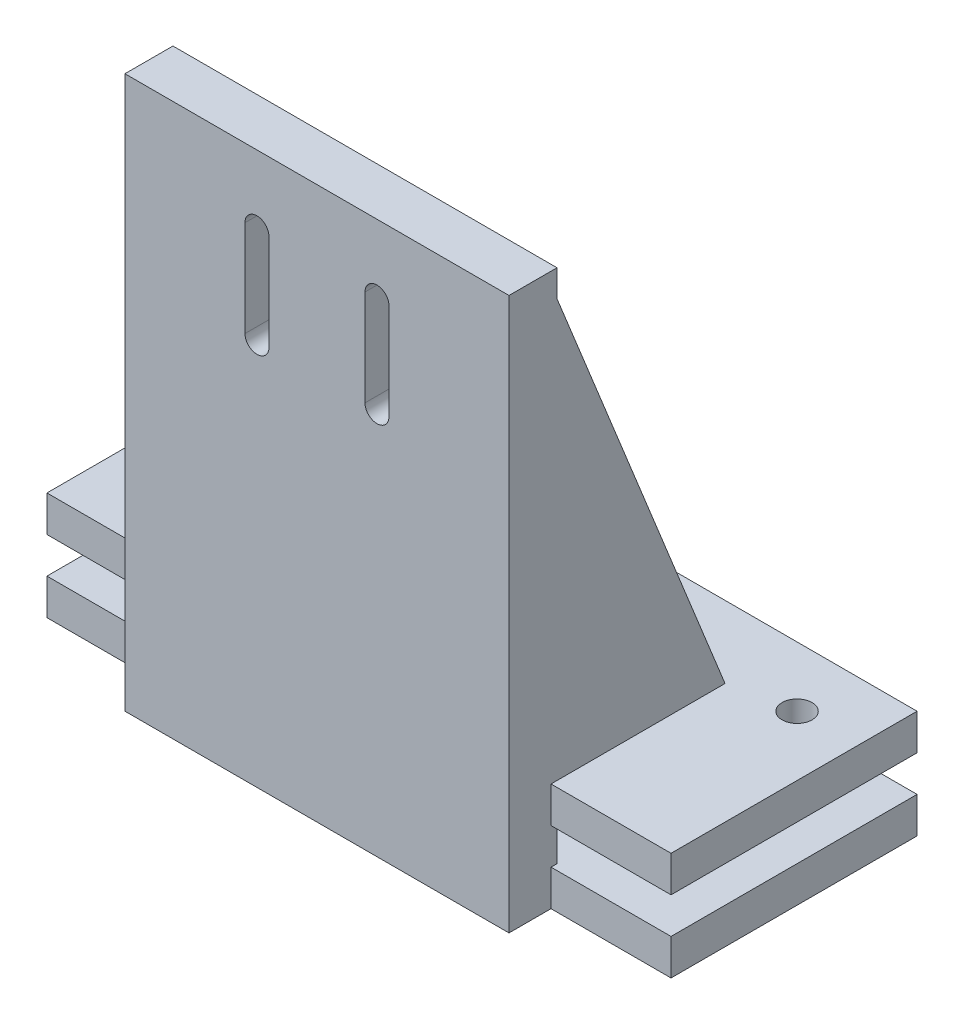
ISO-10303-21;
HEADER;
FILE_DESCRIPTION(('STEP AP214'),'2;1');
FILE_NAME('part.step','',(''),(''),'','','');
FILE_SCHEMA(('AUTOMOTIVE_DESIGN { 1 0 10303 214 1 1 1 1 }'));
ENDSEC;
DATA;
#1=APPLICATION_CONTEXT('core data for automotive mechanical design processes');
#2=APPLICATION_PROTOCOL_DEFINITION('international standard','automotive_design',2000,#1);
#3=PRODUCT_CONTEXT('',#1,'mechanical');
#4=PRODUCT('Part','Part','',(#3));
#5=PRODUCT_RELATED_PRODUCT_CATEGORY('part','',(#4));
#6=PRODUCT_DEFINITION_FORMATION('','',#4);
#7=PRODUCT_DEFINITION_CONTEXT('part definition',#1,'design');
#8=PRODUCT_DEFINITION('design','',#6,#7);
#9=PRODUCT_DEFINITION_SHAPE('','',#8);
#10=(LENGTH_UNIT() NAMED_UNIT(*) SI_UNIT(.MILLI.,.METRE.));
#11=(NAMED_UNIT(*) PLANE_ANGLE_UNIT() SI_UNIT($,.RADIAN.));
#12=(NAMED_UNIT(*) SI_UNIT($,.STERADIAN.) SOLID_ANGLE_UNIT());
#13=UNCERTAINTY_MEASURE_WITH_UNIT(LENGTH_MEASURE(1.E-05),#10,'distance_accuracy_value','');
#14=(GEOMETRIC_REPRESENTATION_CONTEXT(3) GLOBAL_UNCERTAINTY_ASSIGNED_CONTEXT((#13)) GLOBAL_UNIT_ASSIGNED_CONTEXT((#10,
#11,#12)) REPRESENTATION_CONTEXT('',''));
#15=CARTESIAN_POINT('',(0.,0.,0.));
#16=DIRECTION('',(0.,0.,1.));
#17=DIRECTION('',(1.,0.,0.));
#18=AXIS2_PLACEMENT_3D('',#15,#16,#17);
#19=CARTESIAN_POINT('',(0.,0.,0.));
#20=DIRECTION('',(0.,0.,-1.));
#21=DIRECTION('',(-1.,0.,0.));
#22=AXIS2_PLACEMENT_3D('',#19,#20,#21);
#23=PLANE('',#22);
#24=DIRECTION('',(0.,1.,0.));
#25=VECTOR('',#24,1.);
#26=CARTESIAN_POINT('',(32.,-11.5,0.));
#27=LINE('',#26,#25);
#28=CARTESIAN_POINT('',(32.,76.0172413793104,0.));
#29=VERTEX_POINT('',#28);
#30=CARTESIAN_POINT('',(32.,80.5,0.));
#31=VERTEX_POINT('',#30);
#32=EDGE_CURVE('E419',#29,#31,#27,.T.);
#33=ORIENTED_EDGE('',*,*,#32,.F.);
#34=DIRECTION('',(-1.,0.,0.));
#35=VECTOR('',#34,1.);
#36=CARTESIAN_POINT('',(0.,76.0172413793103,0.));
#37=LINE('',#36,#35);
#38=CARTESIAN_POINT('',(26.,76.0172413793103,0.));
#39=VERTEX_POINT('',#38);
#40=EDGE_CURVE('E314',#29,#39,#37,.T.);
#41=ORIENTED_EDGE('',*,*,#40,.T.);
#42=DIRECTION('',(0.,1.,0.));
#43=VECTOR('',#42,1.);
#44=CARTESIAN_POINT('',(26.,0.,0.));
#45=LINE('',#44,#43);
#46=CARTESIAN_POINT('',(26.,6.5,0.));
#47=VERTEX_POINT('',#46);
#48=EDGE_CURVE('E317',#47,#39,#45,.T.);
#49=ORIENTED_EDGE('',*,*,#48,.F.);
#50=DIRECTION('',(-1.,0.,0.));
#51=VECTOR('',#50,1.);
#52=CARTESIAN_POINT('',(0.,6.5,0.));
#53=LINE('',#52,#51);
#54=CARTESIAN_POINT('',(-26.,6.5,0.));
#55=VERTEX_POINT('',#54);
#56=EDGE_CURVE('E456',#47,#55,#53,.T.);
#57=ORIENTED_EDGE('',*,*,#56,.T.);
#58=DIRECTION('',(0.,1.,0.));
#59=VECTOR('',#58,1.);
#60=CARTESIAN_POINT('',(-26.,0.,0.));
#61=LINE('',#60,#59);
#62=CARTESIAN_POINT('',(-26.,76.0172413793103,0.));
#63=VERTEX_POINT('',#62);
#64=EDGE_CURVE('E327',#55,#63,#61,.T.);
#65=ORIENTED_EDGE('',*,*,#64,.T.);
#66=DIRECTION('',(-1.,0.,0.));
#67=VECTOR('',#66,1.);
#68=CARTESIAN_POINT('',(0.,76.0172413793103,0.));
#69=LINE('',#68,#67);
#70=CARTESIAN_POINT('',(-32.,76.0172413793103,0.));
#71=VERTEX_POINT('',#70);
#72=EDGE_CURVE('E330',#63,#71,#69,.T.);
#73=ORIENTED_EDGE('',*,*,#72,.T.);
#74=DIRECTION('',(0.,-1.,0.));
#75=VECTOR('',#74,1.);
#76=CARTESIAN_POINT('',(-32.,-11.5,0.));
#77=LINE('',#76,#75);
#78=CARTESIAN_POINT('',(-32.,80.5,0.));
#79=VERTEX_POINT('',#78);
#80=EDGE_CURVE('E424',#79,#71,#77,.T.);
#81=ORIENTED_EDGE('',*,*,#80,.F.);
#82=DIRECTION('',(-1.,0.,0.));
#83=VECTOR('',#82,1.);
#84=CARTESIAN_POINT('',(-32.,80.5,0.));
#85=LINE('',#84,#83);
#86=EDGE_CURVE('E434',#31,#79,#85,.T.);
#87=ORIENTED_EDGE('',*,*,#86,.F.);
#88=EDGE_LOOP('',(#33,#41,#49,#57,#65,#73,#81,#87));
#89=FACE_BOUND('',#88,.T.);
#90=DIRECTION('',(0.,-1.,0.));
#91=VECTOR('',#90,1.);
#92=CARTESIAN_POINT('',(8.,69.,0.));
#93=LINE('',#92,#91);
#94=CARTESIAN_POINT('',(8.,69.,0.));
#95=VERTEX_POINT('',#94);
#96=CARTESIAN_POINT('',(8.,53.,0.));
#97=VERTEX_POINT('',#96);
#98=EDGE_CURVE('E279',#95,#97,#93,.T.);
#99=ORIENTED_EDGE('',*,*,#98,.T.);
#100=CARTESIAN_POINT('',(10.,53.,0.));
#101=DIRECTION('',(0.,0.,1.));
#102=DIRECTION('',(1.,0.,0.));
#103=AXIS2_PLACEMENT_3D('',#100,#101,#102);
#104=CIRCLE('',#103,2.);
#105=CARTESIAN_POINT('',(12.,53.,0.));
#106=VERTEX_POINT('',#105);
#107=EDGE_CURVE('E60',#97,#106,#104,.T.);
#108=ORIENTED_EDGE('',*,*,#107,.T.);
#109=DIRECTION('',(0.,1.,0.));
#110=VECTOR('',#109,1.);
#111=CARTESIAN_POINT('',(12.,53.,0.));
#112=LINE('',#111,#110);
#113=CARTESIAN_POINT('',(12.,69.,0.));
#114=VERTEX_POINT('',#113);
#115=EDGE_CURVE('E288',#106,#114,#112,.T.);
#116=ORIENTED_EDGE('',*,*,#115,.T.);
#117=CARTESIAN_POINT('',(10.,69.,0.));
#118=DIRECTION('',(0.,0.,1.));
#119=DIRECTION('',(1.,0.,0.));
#120=AXIS2_PLACEMENT_3D('',#117,#118,#119);
#121=CIRCLE('',#120,2.);
#122=EDGE_CURVE('E292',#114,#95,#121,.T.);
#123=ORIENTED_EDGE('',*,*,#122,.T.);
#124=EDGE_LOOP('',(#99,#108,#116,#123));
#125=FACE_BOUND('',#124,.T.);
#126=DIRECTION('',(0.,-1.,0.));
#127=VECTOR('',#126,1.);
#128=CARTESIAN_POINT('',(-12.,69.,0.));
#129=LINE('',#128,#127);
#130=CARTESIAN_POINT('',(-12.,69.,0.));
#131=VERTEX_POINT('',#130);
#132=CARTESIAN_POINT('',(-12.,53.,0.));
#133=VERTEX_POINT('',#132);
#134=EDGE_CURVE('E244',#131,#133,#129,.T.);
#135=ORIENTED_EDGE('',*,*,#134,.T.);
#136=CARTESIAN_POINT('',(-10.,53.,0.));
#137=DIRECTION('',(0.,0.,1.));
#138=DIRECTION('',(1.,0.,0.));
#139=AXIS2_PLACEMENT_3D('',#136,#137,#138);
#140=CIRCLE('',#139,2.);
#141=CARTESIAN_POINT('',(-8.,53.,0.));
#142=VERTEX_POINT('',#141);
#143=EDGE_CURVE('E52',#133,#142,#140,.T.);
#144=ORIENTED_EDGE('',*,*,#143,.T.);
#145=DIRECTION('',(0.,1.,0.));
#146=VECTOR('',#145,1.);
#147=CARTESIAN_POINT('',(-8.,53.,0.));
#148=LINE('',#147,#146);
#149=CARTESIAN_POINT('',(-8.,69.,0.));
#150=VERTEX_POINT('',#149);
#151=EDGE_CURVE('E250',#142,#150,#148,.T.);
#152=ORIENTED_EDGE('',*,*,#151,.T.);
#153=CARTESIAN_POINT('',(-10.,69.,0.));
#154=DIRECTION('',(0.,0.,1.));
#155=DIRECTION('',(1.,0.,0.));
#156=AXIS2_PLACEMENT_3D('',#153,#154,#155);
#157=CIRCLE('',#156,2.);
#158=EDGE_CURVE('E267',#150,#131,#157,.T.);
#159=ORIENTED_EDGE('',*,*,#158,.T.);
#160=EDGE_LOOP('',(#135,#144,#152,#159));
#161=FACE_BOUND('',#160,.T.);
#162=ADVANCED_FACE('F35',(#89,#125,#161),#23,.T.);
#163=CARTESIAN_POINT('',(0.,0.,8.));
#164=DIRECTION('',(0.,0.,-1.));
#165=DIRECTION('',(-1.,0.,0.));
#166=AXIS2_PLACEMENT_3D('',#163,#164,#165);
#167=PLANE('',#166);
#168=CARTESIAN_POINT('',(10.,53.,8.));
#169=DIRECTION('',(0.,0.,1.));
#170=DIRECTION('',(1.,0.,0.));
#171=AXIS2_PLACEMENT_3D('',#168,#169,#170);
#172=CIRCLE('',#171,2.);
#173=CARTESIAN_POINT('',(8.,53.,8.));
#174=VERTEX_POINT('',#173);
#175=CARTESIAN_POINT('',(12.,53.,8.));
#176=VERTEX_POINT('',#175);
#177=EDGE_CURVE('E276',#174,#176,#172,.T.);
#178=ORIENTED_EDGE('',*,*,#177,.F.);
#179=DIRECTION('',(0.,-1.,0.));
#180=VECTOR('',#179,1.);
#181=CARTESIAN_POINT('',(8.,69.,8.));
#182=LINE('',#181,#180);
#183=CARTESIAN_POINT('',(8.,69.,8.));
#184=VERTEX_POINT('',#183);
#185=EDGE_CURVE('E284',#184,#174,#182,.T.);
#186=ORIENTED_EDGE('',*,*,#185,.F.);
#187=CARTESIAN_POINT('',(10.,69.,8.));
#188=DIRECTION('',(0.,0.,1.));
#189=DIRECTION('',(1.,0.,0.));
#190=AXIS2_PLACEMENT_3D('',#187,#188,#189);
#191=CIRCLE('',#190,2.);
#192=CARTESIAN_POINT('',(12.,69.,8.));
#193=VERTEX_POINT('',#192);
#194=EDGE_CURVE('E281',#193,#184,#191,.T.);
#195=ORIENTED_EDGE('',*,*,#194,.F.);
#196=DIRECTION('',(0.,1.,0.));
#197=VECTOR('',#196,1.);
#198=CARTESIAN_POINT('',(12.,53.,8.));
#199=LINE('',#198,#197);
#200=EDGE_CURVE('E278',#176,#193,#199,.T.);
#201=ORIENTED_EDGE('',*,*,#200,.F.);
#202=EDGE_LOOP('',(#178,#186,#195,#201));
#203=FACE_BOUND('',#202,.T.);
#204=DIRECTION('',(0.,1.,0.));
#205=VECTOR('',#204,1.);
#206=CARTESIAN_POINT('',(32.,-11.5,8.));
#207=LINE('',#206,#205);
#208=CARTESIAN_POINT('',(32.,-11.5,8.));
#209=VERTEX_POINT('',#208);
#210=CARTESIAN_POINT('',(32.,80.5,8.));
#211=VERTEX_POINT('',#210);
#212=EDGE_CURVE('E420',#209,#211,#207,.T.);
#213=ORIENTED_EDGE('',*,*,#212,.T.);
#214=DIRECTION('',(-1.,0.,0.));
#215=VECTOR('',#214,1.);
#216=CARTESIAN_POINT('',(-32.,80.5,8.));
#217=LINE('',#216,#215);
#218=CARTESIAN_POINT('',(-32.,80.5,8.));
#219=VERTEX_POINT('',#218);
#220=EDGE_CURVE('E423',#211,#219,#217,.T.);
#221=ORIENTED_EDGE('',*,*,#220,.T.);
#222=DIRECTION('',(0.,-1.,0.));
#223=VECTOR('',#222,1.);
#224=CARTESIAN_POINT('',(-32.,-11.5,8.));
#225=LINE('',#224,#223);
#226=CARTESIAN_POINT('',(-32.,-11.5,8.));
#227=VERTEX_POINT('',#226);
#228=EDGE_CURVE('E426',#219,#227,#225,.T.);
#229=ORIENTED_EDGE('',*,*,#228,.T.);
#230=DIRECTION('',(1.,0.,0.));
#231=VECTOR('',#230,1.);
#232=CARTESIAN_POINT('',(-32.,-11.5,8.));
#233=LINE('',#232,#231);
#234=EDGE_CURVE('E428',#227,#209,#233,.T.);
#235=ORIENTED_EDGE('',*,*,#234,.T.);
#236=EDGE_LOOP('',(#213,#221,#229,#235));
#237=FACE_BOUND('',#236,.T.);
#238=CARTESIAN_POINT('',(-10.,53.,8.));
#239=DIRECTION('',(0.,0.,1.));
#240=DIRECTION('',(1.,0.,0.));
#241=AXIS2_PLACEMENT_3D('',#238,#239,#240);
#242=CIRCLE('',#241,2.);
#243=CARTESIAN_POINT('',(-12.,53.,8.));
#244=VERTEX_POINT('',#243);
#245=CARTESIAN_POINT('',(-8.,53.,8.));
#246=VERTEX_POINT('',#245);
#247=EDGE_CURVE('E235',#244,#246,#242,.T.);
#248=ORIENTED_EDGE('',*,*,#247,.F.);
#249=DIRECTION('',(0.,-1.,0.));
#250=VECTOR('',#249,1.);
#251=CARTESIAN_POINT('',(-12.,69.,8.));
#252=LINE('',#251,#250);
#253=CARTESIAN_POINT('',(-12.,69.,8.));
#254=VERTEX_POINT('',#253);
#255=EDGE_CURVE('E259',#254,#244,#252,.T.);
#256=ORIENTED_EDGE('',*,*,#255,.F.);
#257=CARTESIAN_POINT('',(-10.,69.,8.));
#258=DIRECTION('',(0.,0.,1.));
#259=DIRECTION('',(1.,0.,0.));
#260=AXIS2_PLACEMENT_3D('',#257,#258,#259);
#261=CIRCLE('',#260,2.);
#262=CARTESIAN_POINT('',(-8.,69.,8.));
#263=VERTEX_POINT('',#262);
#264=EDGE_CURVE('E257',#263,#254,#261,.T.);
#265=ORIENTED_EDGE('',*,*,#264,.F.);
#266=DIRECTION('',(0.,1.,0.));
#267=VECTOR('',#266,1.);
#268=CARTESIAN_POINT('',(-8.,53.,8.));
#269=LINE('',#268,#267);
#270=EDGE_CURVE('E243',#246,#263,#269,.T.);
#271=ORIENTED_EDGE('',*,*,#270,.F.);
#272=EDGE_LOOP('',(#248,#256,#265,#271));
#273=FACE_BOUND('',#272,.T.);
#274=ADVANCED_FACE('F255',(#203,#237,#273),#167,.F.);
#275=CARTESIAN_POINT('',(-52.,6.5,1.));
#276=DIRECTION('',(0.,-1.,0.));
#277=DIRECTION('',(0.,0.,-1.));
#278=AXIS2_PLACEMENT_3D('',#275,#276,#277);
#279=PLANE('',#278);
#280=CARTESIAN_POINT('',(-42.,6.5,-30.));
#281=DIRECTION('',(0.,1.,0.));
#282=DIRECTION('',(0.,0.,1.));
#283=AXIS2_PLACEMENT_3D('',#280,#281,#282);
#284=CIRCLE('',#283,2.5);
#285=CARTESIAN_POINT('',(-42.,6.5,-27.5));
#286=VERTEX_POINT('',#285);
#287=EDGE_CURVE('E461',#286,#286,#284,.T.);
#288=ORIENTED_EDGE('',*,*,#287,.F.);
#289=EDGE_LOOP('',(#288));
#290=FACE_BOUND('',#289,.T.);
#291=CARTESIAN_POINT('',(42.,6.5,-30.));
#292=DIRECTION('',(0.,1.,0.));
#293=DIRECTION('',(0.,0.,1.));
#294=AXIS2_PLACEMENT_3D('',#291,#292,#293);
#295=CIRCLE('',#294,2.5);
#296=CARTESIAN_POINT('',(42.,6.5,-27.5));
#297=VERTEX_POINT('',#296);
#298=EDGE_CURVE('E472',#297,#297,#295,.T.);
#299=ORIENTED_EDGE('',*,*,#298,.F.);
#300=EDGE_LOOP('',(#299));
#301=FACE_BOUND('',#300,.T.);
#302=DIRECTION('',(-1.,0.,0.));
#303=VECTOR('',#302,1.);
#304=CARTESIAN_POINT('',(32.,6.5,-28.));
#305=LINE('',#304,#303);
#306=CARTESIAN_POINT('',(32.,6.5,-28.));
#307=VERTEX_POINT('',#306);
#308=CARTESIAN_POINT('',(26.,6.5,-28.));
#309=VERTEX_POINT('',#308);
#310=EDGE_CURVE('E306',#307,#309,#305,.T.);
#311=ORIENTED_EDGE('',*,*,#310,.F.);
#312=DIRECTION('',(0.,0.,1.));
#313=VECTOR('',#312,1.);
#314=CARTESIAN_POINT('',(32.,6.5,8.));
#315=LINE('',#314,#313);
#316=CARTESIAN_POINT('',(32.,6.5,1.));
#317=VERTEX_POINT('',#316);
#318=EDGE_CURVE('E373',#307,#317,#315,.T.);
#319=ORIENTED_EDGE('',*,*,#318,.T.);
#320=DIRECTION('',(-1.,0.,0.));
#321=VECTOR('',#320,1.);
#322=CARTESIAN_POINT('',(-52.,6.5,1.));
#323=LINE('',#322,#321);
#324=CARTESIAN_POINT('',(52.,6.5,1.));
#325=VERTEX_POINT('',#324);
#326=EDGE_CURVE('E339',#325,#317,#323,.T.);
#327=ORIENTED_EDGE('',*,*,#326,.F.);
#328=DIRECTION('',(0.,0.,-1.));
#329=VECTOR('',#328,1.);
#330=CARTESIAN_POINT('',(52.,6.5,1.));
#331=LINE('',#330,#329);
#332=CARTESIAN_POINT('',(52.,6.5,-40.));
#333=VERTEX_POINT('',#332);
#334=EDGE_CURVE('E364',#325,#333,#331,.T.);
#335=ORIENTED_EDGE('',*,*,#334,.T.);
#336=DIRECTION('',(-1.,0.,0.));
#337=VECTOR('',#336,1.);
#338=CARTESIAN_POINT('',(-52.,6.5,-40.));
#339=LINE('',#338,#337);
#340=CARTESIAN_POINT('',(-52.,6.5,-40.));
#341=VERTEX_POINT('',#340);
#342=EDGE_CURVE('E351',#333,#341,#339,.T.);
#343=ORIENTED_EDGE('',*,*,#342,.T.);
#344=DIRECTION('',(0.,0.,-1.));
#345=VECTOR('',#344,1.);
#346=CARTESIAN_POINT('',(-52.,6.5,1.));
#347=LINE('',#346,#345);
#348=CARTESIAN_POINT('',(-52.,6.5,1.));
#349=VERTEX_POINT('',#348);
#350=EDGE_CURVE('E361',#349,#341,#347,.T.);
#351=ORIENTED_EDGE('',*,*,#350,.F.);
#352=CARTESIAN_POINT('',(-32.,6.5,1.));
#353=VERTEX_POINT('',#352);
#354=EDGE_CURVE('E337',#353,#349,#323,.T.);
#355=ORIENTED_EDGE('',*,*,#354,.F.);
#356=DIRECTION('',(0.,0.,-1.));
#357=VECTOR('',#356,1.);
#358=CARTESIAN_POINT('',(-32.,6.5,8.));
#359=LINE('',#358,#357);
#360=CARTESIAN_POINT('',(-32.,6.5,-28.));
#361=VERTEX_POINT('',#360);
#362=EDGE_CURVE('E371',#353,#361,#359,.T.);
#363=ORIENTED_EDGE('',*,*,#362,.T.);
#364=DIRECTION('',(-1.,0.,0.));
#365=VECTOR('',#364,1.);
#366=CARTESIAN_POINT('',(-26.,6.5,-28.));
#367=LINE('',#366,#365);
#368=CARTESIAN_POINT('',(-26.,6.5,-28.));
#369=VERTEX_POINT('',#368);
#370=EDGE_CURVE('E323',#369,#361,#367,.T.);
#371=ORIENTED_EDGE('',*,*,#370,.F.);
#372=DIRECTION('',(0.,0.,-1.));
#373=VECTOR('',#372,1.);
#374=CARTESIAN_POINT('',(-26.,6.5,1.));
#375=LINE('',#374,#373);
#376=EDGE_CURVE('E11',#55,#369,#375,.T.);
#377=ORIENTED_EDGE('',*,*,#376,.F.);
#378=ORIENTED_EDGE('',*,*,#56,.F.);
#379=DIRECTION('',(0.,0.,-1.));
#380=VECTOR('',#379,1.);
#381=CARTESIAN_POINT('',(26.,6.5,-28.));
#382=LINE('',#381,#380);
#383=EDGE_CURVE('E307',#47,#309,#382,.T.);
#384=ORIENTED_EDGE('',*,*,#383,.T.);
#385=EDGE_LOOP('',(#311,#319,#327,#335,#343,#351,#355,#363,#371,#377,#378,#384));
#386=FACE_BOUND('',#385,.T.);
#387=ADVANCED_FACE('F520',(#290,#301,#386),#279,.F.);
#388=CARTESIAN_POINT('',(32.,-11.5,8.));
#389=DIRECTION('',(-1.,0.,0.));
#390=DIRECTION('',(0.,0.,1.));
#391=AXIS2_PLACEMENT_3D('',#388,#389,#390);
#392=PLANE('',#391);
#393=ORIENTED_EDGE('',*,*,#318,.F.);
#394=DIRECTION('',(0.,0.927585542017196,0.373610843312482));
#395=VECTOR('',#394,1.);
#396=CARTESIAN_POINT('',(32.,78.5,1.));
#397=LINE('',#396,#395);
#398=EDGE_CURVE('E303',#307,#29,#397,.T.);
#399=ORIENTED_EDGE('',*,*,#398,.T.);
#400=ORIENTED_EDGE('',*,*,#32,.T.);
#401=DIRECTION('',(0.,0.,-1.));
#402=VECTOR('',#401,1.);
#403=CARTESIAN_POINT('',(32.,80.5,8.));
#404=LINE('',#403,#402);
#405=EDGE_CURVE('E447',#211,#31,#404,.T.);
#406=ORIENTED_EDGE('',*,*,#405,.F.);
#407=ORIENTED_EDGE('',*,*,#212,.F.);
#408=DIRECTION('',(0.,0.,-1.));
#409=VECTOR('',#408,1.);
#410=CARTESIAN_POINT('',(32.,-11.5,8.));
#411=LINE('',#410,#409);
#412=CARTESIAN_POINT('',(32.,-11.5,1.));
#413=VERTEX_POINT('',#412);
#414=EDGE_CURVE('E430',#209,#413,#411,.T.);
#415=ORIENTED_EDGE('',*,*,#414,.T.);
#416=DIRECTION('',(0.,-1.,0.));
#417=VECTOR('',#416,1.);
#418=CARTESIAN_POINT('',(32.,-11.5,1.));
#419=LINE('',#418,#417);
#420=CARTESIAN_POINT('',(32.,-5.5,1.));
#421=VERTEX_POINT('',#420);
#422=EDGE_CURVE('E417',#421,#413,#419,.T.);
#423=ORIENTED_EDGE('',*,*,#422,.F.);
#424=DIRECTION('',(0.,0.,1.));
#425=VECTOR('',#424,1.);
#426=CARTESIAN_POINT('',(32.,-5.5,8.));
#427=LINE('',#426,#425);
#428=CARTESIAN_POINT('',(32.,-5.5,0.));
#429=VERTEX_POINT('',#428);
#430=EDGE_CURVE('E413',#429,#421,#427,.T.);
#431=ORIENTED_EDGE('',*,*,#430,.F.);
#432=CARTESIAN_POINT('',(32.,0.5,0.));
#433=VERTEX_POINT('',#432);
#434=EDGE_CURVE('E431',#429,#433,#27,.T.);
#435=ORIENTED_EDGE('',*,*,#434,.T.);
#436=DIRECTION('',(0.,0.,-1.));
#437=VECTOR('',#436,1.);
#438=CARTESIAN_POINT('',(32.,0.5,8.));
#439=LINE('',#438,#437);
#440=CARTESIAN_POINT('',(32.,0.5,1.));
#441=VERTEX_POINT('',#440);
#442=EDGE_CURVE('E369',#441,#433,#439,.T.);
#443=ORIENTED_EDGE('',*,*,#442,.F.);
#444=DIRECTION('',(0.,-1.,0.));
#445=VECTOR('',#444,1.);
#446=CARTESIAN_POINT('',(32.,-11.5,1.));
#447=LINE('',#446,#445);
#448=EDGE_CURVE('E375',#317,#441,#447,.T.);
#449=ORIENTED_EDGE('',*,*,#448,.F.);
#450=EDGE_LOOP('',(#393,#399,#400,#406,#407,#415,#423,#431,#435,#443,#449));
#451=FACE_BOUND('',#450,.T.);
#452=ADVANCED_FACE('F37',(#451),#392,.F.);
#453=CARTESIAN_POINT('',(-32.,-11.5,8.));
#454=DIRECTION('',(1.,0.,0.));
#455=DIRECTION('',(0.,0.,-1.));
#456=AXIS2_PLACEMENT_3D('',#453,#454,#455);
#457=PLANE('',#456);
#458=ORIENTED_EDGE('',*,*,#80,.T.);
#459=DIRECTION('',(0.,0.927585542017196,0.373610843312482));
#460=VECTOR('',#459,1.);
#461=CARTESIAN_POINT('',(-32.,78.5,1.));
#462=LINE('',#461,#460);
#463=EDGE_CURVE('E319',#361,#71,#462,.T.);
#464=ORIENTED_EDGE('',*,*,#463,.F.);
#465=ORIENTED_EDGE('',*,*,#362,.F.);
#466=DIRECTION('',(0.,1.,0.));
#467=VECTOR('',#466,1.);
#468=CARTESIAN_POINT('',(-32.,-11.5,1.));
#469=LINE('',#468,#467);
#470=CARTESIAN_POINT('',(-32.,0.5,1.));
#471=VERTEX_POINT('',#470);
#472=EDGE_CURVE('E44',#471,#353,#469,.T.);
#473=ORIENTED_EDGE('',*,*,#472,.F.);
#474=DIRECTION('',(0.,0.,1.));
#475=VECTOR('',#474,1.);
#476=CARTESIAN_POINT('',(-32.,0.5,8.));
#477=LINE('',#476,#475);
#478=CARTESIAN_POINT('',(-32.,0.5,0.));
#479=VERTEX_POINT('',#478);
#480=EDGE_CURVE('E367',#479,#471,#477,.T.);
#481=ORIENTED_EDGE('',*,*,#480,.F.);
#482=CARTESIAN_POINT('',(-32.,-5.5,0.));
#483=VERTEX_POINT('',#482);
#484=EDGE_CURVE('E436',#479,#483,#77,.T.);
#485=ORIENTED_EDGE('',*,*,#484,.T.);
#486=DIRECTION('',(0.,0.,-1.));
#487=VECTOR('',#486,1.);
#488=CARTESIAN_POINT('',(-32.,-5.5,8.));
#489=LINE('',#488,#487);
#490=CARTESIAN_POINT('',(-32.,-5.5,1.));
#491=VERTEX_POINT('',#490);
#492=EDGE_CURVE('E410',#491,#483,#489,.T.);
#493=ORIENTED_EDGE('',*,*,#492,.F.);
#494=DIRECTION('',(0.,1.,0.));
#495=VECTOR('',#494,1.);
#496=CARTESIAN_POINT('',(-32.,-11.5,1.));
#497=LINE('',#496,#495);
#498=CARTESIAN_POINT('',(-32.,-11.5,1.));
#499=VERTEX_POINT('',#498);
#500=EDGE_CURVE('E415',#499,#491,#497,.T.);
#501=ORIENTED_EDGE('',*,*,#500,.F.);
#502=DIRECTION('',(0.,0.,-1.));
#503=VECTOR('',#502,1.);
#504=CARTESIAN_POINT('',(-32.,-11.5,8.));
#505=LINE('',#504,#503);
#506=EDGE_CURVE('E441',#227,#499,#505,.T.);
#507=ORIENTED_EDGE('',*,*,#506,.F.);
#508=ORIENTED_EDGE('',*,*,#228,.F.);
#509=DIRECTION('',(0.,0.,-1.));
#510=VECTOR('',#509,1.);
#511=CARTESIAN_POINT('',(-32.,80.5,8.));
#512=LINE('',#511,#510);
#513=EDGE_CURVE('E444',#219,#79,#512,.T.);
#514=ORIENTED_EDGE('',*,*,#513,.T.);
#515=EDGE_LOOP('',(#458,#464,#465,#473,#481,#485,#493,#501,#507,#508,#514));
#516=FACE_BOUND('',#515,.T.);
#517=ADVANCED_FACE('F511',(#516),#457,.F.);
#518=ORIENTED_EDGE('',*,*,#484,.F.);
#519=DIRECTION('',(1.,0.,0.));
#520=VECTOR('',#519,1.);
#521=CARTESIAN_POINT('',(0.,0.5,0.));
#522=LINE('',#521,#520);
#523=EDGE_CURVE('E453',#479,#433,#522,.T.);
#524=ORIENTED_EDGE('',*,*,#523,.T.);
#525=ORIENTED_EDGE('',*,*,#434,.F.);
#526=DIRECTION('',(-1.,0.,0.));
#527=VECTOR('',#526,1.);
#528=CARTESIAN_POINT('',(0.,-5.5,0.));
#529=LINE('',#528,#527);
#530=EDGE_CURVE('E450',#429,#483,#529,.T.);
#531=ORIENTED_EDGE('',*,*,#530,.T.);
#532=EDGE_LOOP('',(#518,#524,#525,#531));
#533=FACE_BOUND('',#532,.T.);
#534=ADVANCED_FACE('F506',(#533),#23,.T.);
#535=CARTESIAN_POINT('',(-32.,80.5,8.));
#536=DIRECTION('',(0.,-1.,0.));
#537=DIRECTION('',(0.,0.,-1.));
#538=AXIS2_PLACEMENT_3D('',#535,#536,#537);
#539=PLANE('',#538);
#540=ORIENTED_EDGE('',*,*,#86,.T.);
#541=ORIENTED_EDGE('',*,*,#513,.F.);
#542=ORIENTED_EDGE('',*,*,#220,.F.);
#543=ORIENTED_EDGE('',*,*,#405,.T.);
#544=EDGE_LOOP('',(#540,#541,#542,#543));
#545=FACE_BOUND('',#544,.T.);
#546=ADVANCED_FACE('F547',(#545),#539,.F.);
#547=CARTESIAN_POINT('',(-32.,-11.5,8.));
#548=DIRECTION('',(0.,1.,0.));
#549=DIRECTION('',(0.,0.,1.));
#550=AXIS2_PLACEMENT_3D('',#547,#548,#549);
#551=PLANE('',#550);
#552=CARTESIAN_POINT('',(-42.,-11.5,-30.));
#553=DIRECTION('',(0.,1.,0.));
#554=DIRECTION('',(0.,0.,1.));
#555=AXIS2_PLACEMENT_3D('',#552,#553,#554);
#556=CIRCLE('',#555,2.5);
#557=CARTESIAN_POINT('',(-42.,-11.5,-27.5));
#558=VERTEX_POINT('',#557);
#559=EDGE_CURVE('E467',#558,#558,#556,.T.);
#560=ORIENTED_EDGE('',*,*,#559,.T.);
#561=EDGE_LOOP('',(#560));
#562=FACE_BOUND('',#561,.T.);
#563=CARTESIAN_POINT('',(42.,-11.5,-30.));
#564=DIRECTION('',(0.,1.,0.));
#565=DIRECTION('',(0.,0.,1.));
#566=AXIS2_PLACEMENT_3D('',#563,#564,#565);
#567=CIRCLE('',#566,2.5);
#568=CARTESIAN_POINT('',(42.,-11.5,-27.5));
#569=VERTEX_POINT('',#568);
#570=EDGE_CURVE('E477',#569,#569,#567,.T.);
#571=ORIENTED_EDGE('',*,*,#570,.T.);
#572=EDGE_LOOP('',(#571));
#573=FACE_BOUND('',#572,.T.);
#574=ORIENTED_EDGE('',*,*,#506,.T.);
#575=DIRECTION('',(1.,0.,0.));
#576=VECTOR('',#575,1.);
#577=CARTESIAN_POINT('',(-52.,-11.5,1.));
#578=LINE('',#577,#576);
#579=CARTESIAN_POINT('',(-52.,-11.5,1.));
#580=VERTEX_POINT('',#579);
#581=EDGE_CURVE('E389',#580,#499,#578,.T.);
#582=ORIENTED_EDGE('',*,*,#581,.F.);
#583=DIRECTION('',(0.,0.,-1.));
#584=VECTOR('',#583,1.);
#585=CARTESIAN_POINT('',(-52.,-11.5,1.));
#586=LINE('',#585,#584);
#587=CARTESIAN_POINT('',(-52.,-11.5,-40.));
#588=VERTEX_POINT('',#587);
#589=EDGE_CURVE('E401',#580,#588,#586,.T.);
#590=ORIENTED_EDGE('',*,*,#589,.T.);
#591=DIRECTION('',(1.,0.,0.));
#592=VECTOR('',#591,1.);
#593=CARTESIAN_POINT('',(-52.,-11.5,-40.));
#594=LINE('',#593,#592);
#595=CARTESIAN_POINT('',(52.,-11.5,-40.));
#596=VERTEX_POINT('',#595);
#597=EDGE_CURVE('E382',#588,#596,#594,.T.);
#598=ORIENTED_EDGE('',*,*,#597,.T.);
#599=DIRECTION('',(0.,0.,-1.));
#600=VECTOR('',#599,1.);
#601=CARTESIAN_POINT('',(52.,-11.5,1.));
#602=LINE('',#601,#600);
#603=CARTESIAN_POINT('',(52.,-11.5,1.));
#604=VERTEX_POINT('',#603);
#605=EDGE_CURVE('E391',#604,#596,#602,.T.);
#606=ORIENTED_EDGE('',*,*,#605,.F.);
#607=EDGE_CURVE('E388',#413,#604,#578,.T.);
#608=ORIENTED_EDGE('',*,*,#607,.F.);
#609=ORIENTED_EDGE('',*,*,#414,.F.);
#610=ORIENTED_EDGE('',*,*,#234,.F.);
#611=EDGE_LOOP('',(#574,#582,#590,#598,#606,#608,#609,#610));
#612=FACE_BOUND('',#611,.T.);
#613=ADVANCED_FACE('F556',(#562,#573,#612),#551,.F.);
#614=CARTESIAN_POINT('',(0.,0.,1.));
#615=DIRECTION('',(0.,0.,-1.));
#616=DIRECTION('',(-1.,0.,0.));
#617=AXIS2_PLACEMENT_3D('',#614,#615,#616);
#618=PLANE('',#617);
#619=DIRECTION('',(-1.,0.,0.));
#620=VECTOR('',#619,1.);
#621=CARTESIAN_POINT('',(-52.,-5.5,1.));
#622=LINE('',#621,#620);
#623=CARTESIAN_POINT('',(52.,-5.5,1.));
#624=VERTEX_POINT('',#623);
#625=EDGE_CURVE('E383',#624,#421,#622,.T.);
#626=ORIENTED_EDGE('',*,*,#625,.T.);
#627=ORIENTED_EDGE('',*,*,#422,.T.);
#628=ORIENTED_EDGE('',*,*,#607,.T.);
#629=DIRECTION('',(0.,1.,0.));
#630=VECTOR('',#629,1.);
#631=CARTESIAN_POINT('',(52.,-11.5,1.));
#632=LINE('',#631,#630);
#633=EDGE_CURVE('E378',#604,#624,#632,.T.);
#634=ORIENTED_EDGE('',*,*,#633,.T.);
#635=EDGE_LOOP('',(#626,#627,#628,#634));
#636=FACE_BOUND('',#635,.T.);
#637=ADVANCED_FACE('F559',(#636),#618,.F.);
#638=ORIENTED_EDGE('',*,*,#581,.T.);
#639=ORIENTED_EDGE('',*,*,#500,.T.);
#640=CARTESIAN_POINT('',(-52.,-5.5,1.));
#641=VERTEX_POINT('',#640);
#642=EDGE_CURVE('E381',#491,#641,#622,.T.);
#643=ORIENTED_EDGE('',*,*,#642,.T.);
#644=DIRECTION('',(0.,-1.,0.));
#645=VECTOR('',#644,1.);
#646=CARTESIAN_POINT('',(-52.,-11.5,1.));
#647=LINE('',#646,#645);
#648=EDGE_CURVE('E386',#641,#580,#647,.T.);
#649=ORIENTED_EDGE('',*,*,#648,.T.);
#650=EDGE_LOOP('',(#638,#639,#643,#649));
#651=FACE_BOUND('',#650,.T.);
#652=ADVANCED_FACE('F571',(#651),#618,.F.);
#653=CARTESIAN_POINT('',(-52.,-5.5,1.));
#654=DIRECTION('',(0.,-1.,0.));
#655=DIRECTION('',(0.,0.,-1.));
#656=AXIS2_PLACEMENT_3D('',#653,#654,#655);
#657=PLANE('',#656);
#658=CARTESIAN_POINT('',(-42.,-5.5,-30.));
#659=DIRECTION('',(0.,-1.,0.));
#660=DIRECTION('',(0.,0.,-1.));
#661=AXIS2_PLACEMENT_3D('',#658,#659,#660);
#662=CIRCLE('',#661,2.5);
#663=CARTESIAN_POINT('',(-42.,-5.5,-32.5));
#664=VERTEX_POINT('',#663);
#665=EDGE_CURVE('E289',#664,#664,#662,.F.);
#666=ORIENTED_EDGE('',*,*,#665,.F.);
#667=EDGE_LOOP('',(#666));
#668=FACE_BOUND('',#667,.T.);
#669=CARTESIAN_POINT('',(42.,-5.5,-30.));
#670=DIRECTION('',(0.,-1.,0.));
#671=DIRECTION('',(0.,0.,-1.));
#672=AXIS2_PLACEMENT_3D('',#669,#670,#671);
#673=CIRCLE('',#672,2.5);
#674=CARTESIAN_POINT('',(42.,-5.5,-32.5));
#675=VERTEX_POINT('',#674);
#676=EDGE_CURVE('E460',#675,#675,#673,.F.);
#677=ORIENTED_EDGE('',*,*,#676,.F.);
#678=EDGE_LOOP('',(#677));
#679=FACE_BOUND('',#678,.T.);
#680=ORIENTED_EDGE('',*,*,#530,.F.);
#681=ORIENTED_EDGE('',*,*,#430,.T.);
#682=ORIENTED_EDGE('',*,*,#625,.F.);
#683=DIRECTION('',(0.,0.,-1.));
#684=VECTOR('',#683,1.);
#685=CARTESIAN_POINT('',(52.,-5.5,1.));
#686=LINE('',#685,#684);
#687=CARTESIAN_POINT('',(52.,-5.5,-40.));
#688=VERTEX_POINT('',#687);
#689=EDGE_CURVE('E407',#624,#688,#686,.T.);
#690=ORIENTED_EDGE('',*,*,#689,.T.);
#691=DIRECTION('',(-1.,0.,0.));
#692=VECTOR('',#691,1.);
#693=CARTESIAN_POINT('',(-52.,-5.5,-40.));
#694=LINE('',#693,#692);
#695=CARTESIAN_POINT('',(-52.,-5.5,-40.));
#696=VERTEX_POINT('',#695);
#697=EDGE_CURVE('E394',#688,#696,#694,.T.);
#698=ORIENTED_EDGE('',*,*,#697,.T.);
#699=DIRECTION('',(0.,0.,-1.));
#700=VECTOR('',#699,1.);
#701=CARTESIAN_POINT('',(-52.,-5.5,1.));
#702=LINE('',#701,#700);
#703=EDGE_CURVE('E404',#641,#696,#702,.T.);
#704=ORIENTED_EDGE('',*,*,#703,.F.);
#705=ORIENTED_EDGE('',*,*,#642,.F.);
#706=ORIENTED_EDGE('',*,*,#492,.T.);
#707=EDGE_LOOP('',(#680,#681,#682,#690,#698,#704,#705,#706));
#708=FACE_BOUND('',#707,.T.);
#709=ADVANCED_FACE('F563',(#668,#679,#708),#657,.F.);
#710=CARTESIAN_POINT('',(52.,-11.5,1.));
#711=DIRECTION('',(-1.,0.,0.));
#712=DIRECTION('',(0.,0.,1.));
#713=AXIS2_PLACEMENT_3D('',#710,#711,#712);
#714=PLANE('',#713);
#715=DIRECTION('',(0.,1.,0.));
#716=VECTOR('',#715,1.);
#717=CARTESIAN_POINT('',(52.,-11.5,-40.));
#718=LINE('',#717,#716);
#719=EDGE_CURVE('E377',#596,#688,#718,.T.);
#720=ORIENTED_EDGE('',*,*,#719,.T.);
#721=ORIENTED_EDGE('',*,*,#689,.F.);
#722=ORIENTED_EDGE('',*,*,#633,.F.);
#723=ORIENTED_EDGE('',*,*,#605,.T.);
#724=EDGE_LOOP('',(#720,#721,#722,#723));
#725=FACE_BOUND('',#724,.T.);
#726=ADVANCED_FACE('F580',(#725),#714,.F.);
#727=CARTESIAN_POINT('',(-52.,-11.5,1.));
#728=DIRECTION('',(1.,0.,0.));
#729=DIRECTION('',(0.,0.,-1.));
#730=AXIS2_PLACEMENT_3D('',#727,#728,#729);
#731=PLANE('',#730);
#732=DIRECTION('',(0.,-1.,0.));
#733=VECTOR('',#732,1.);
#734=CARTESIAN_POINT('',(-52.,-11.5,-40.));
#735=LINE('',#734,#733);
#736=EDGE_CURVE('E396',#696,#588,#735,.T.);
#737=ORIENTED_EDGE('',*,*,#736,.T.);
#738=ORIENTED_EDGE('',*,*,#589,.F.);
#739=ORIENTED_EDGE('',*,*,#648,.F.);
#740=ORIENTED_EDGE('',*,*,#703,.T.);
#741=EDGE_LOOP('',(#737,#738,#739,#740));
#742=FACE_BOUND('',#741,.T.);
#743=ADVANCED_FACE('F574',(#742),#731,.F.);
#744=CARTESIAN_POINT('',(0.,0.,-40.));
#745=DIRECTION('',(0.,0.,-1.));
#746=DIRECTION('',(-1.,0.,0.));
#747=AXIS2_PLACEMENT_3D('',#744,#745,#746);
#748=PLANE('',#747);
#749=ORIENTED_EDGE('',*,*,#719,.F.);
#750=ORIENTED_EDGE('',*,*,#597,.F.);
#751=ORIENTED_EDGE('',*,*,#736,.F.);
#752=ORIENTED_EDGE('',*,*,#697,.F.);
#753=EDGE_LOOP('',(#749,#750,#751,#752));
#754=FACE_BOUND('',#753,.T.);
#755=ADVANCED_FACE('F578',(#754),#748,.T.);
#756=CARTESIAN_POINT('',(0.,0.,1.));
#757=DIRECTION('',(0.,0.,-1.));
#758=DIRECTION('',(-1.,0.,0.));
#759=AXIS2_PLACEMENT_3D('',#756,#757,#758);
#760=PLANE('',#759);
#761=ORIENTED_EDGE('',*,*,#326,.T.);
#762=ORIENTED_EDGE('',*,*,#448,.T.);
#763=DIRECTION('',(1.,0.,0.));
#764=VECTOR('',#763,1.);
#765=CARTESIAN_POINT('',(-52.,0.5,1.));
#766=LINE('',#765,#764);
#767=CARTESIAN_POINT('',(52.,0.5,1.));
#768=VERTEX_POINT('',#767);
#769=EDGE_CURVE('E344',#441,#768,#766,.T.);
#770=ORIENTED_EDGE('',*,*,#769,.T.);
#771=DIRECTION('',(0.,1.,0.));
#772=VECTOR('',#771,1.);
#773=CARTESIAN_POINT('',(52.,0.5,1.));
#774=LINE('',#773,#772);
#775=EDGE_CURVE('E334',#768,#325,#774,.T.);
#776=ORIENTED_EDGE('',*,*,#775,.T.);
#777=EDGE_LOOP('',(#761,#762,#770,#776));
#778=FACE_BOUND('',#777,.T.);
#779=ADVANCED_FACE('F533',(#778),#760,.F.);
#780=CARTESIAN_POINT('',(-52.,0.5,1.));
#781=VERTEX_POINT('',#780);
#782=EDGE_CURVE('E345',#781,#471,#766,.T.);
#783=ORIENTED_EDGE('',*,*,#782,.T.);
#784=ORIENTED_EDGE('',*,*,#472,.T.);
#785=ORIENTED_EDGE('',*,*,#354,.T.);
#786=DIRECTION('',(0.,-1.,0.));
#787=VECTOR('',#786,1.);
#788=CARTESIAN_POINT('',(-52.,0.5,1.));
#789=LINE('',#788,#787);
#790=EDGE_CURVE('E342',#349,#781,#789,.T.);
#791=ORIENTED_EDGE('',*,*,#790,.T.);
#792=EDGE_LOOP('',(#783,#784,#785,#791));
#793=FACE_BOUND('',#792,.T.);
#794=ADVANCED_FACE('F491',(#793),#760,.F.);
#795=CARTESIAN_POINT('',(-52.,0.5,1.));
#796=DIRECTION('',(0.,1.,0.));
#797=DIRECTION('',(0.,0.,1.));
#798=AXIS2_PLACEMENT_3D('',#795,#796,#797);
#799=PLANE('',#798);
#800=CARTESIAN_POINT('',(-42.,0.5,-30.));
#801=DIRECTION('',(0.,1.,0.));
#802=DIRECTION('',(0.,0.,1.));
#803=AXIS2_PLACEMENT_3D('',#800,#801,#802);
#804=CIRCLE('',#803,2.5);
#805=CARTESIAN_POINT('',(-42.,0.5,-27.5));
#806=VERTEX_POINT('',#805);
#807=EDGE_CURVE('E39',#806,#806,#804,.F.);
#808=ORIENTED_EDGE('',*,*,#807,.F.);
#809=EDGE_LOOP('',(#808));
#810=FACE_BOUND('',#809,.T.);
#811=CARTESIAN_POINT('',(42.,0.5,-30.));
#812=DIRECTION('',(0.,1.,0.));
#813=DIRECTION('',(0.,0.,1.));
#814=AXIS2_PLACEMENT_3D('',#811,#812,#813);
#815=CIRCLE('',#814,2.5);
#816=CARTESIAN_POINT('',(42.,0.5,-27.5));
#817=VERTEX_POINT('',#816);
#818=EDGE_CURVE('E458',#817,#817,#815,.F.);
#819=ORIENTED_EDGE('',*,*,#818,.F.);
#820=EDGE_LOOP('',(#819));
#821=FACE_BOUND('',#820,.T.);
#822=ORIENTED_EDGE('',*,*,#769,.F.);
#823=ORIENTED_EDGE('',*,*,#442,.T.);
#824=ORIENTED_EDGE('',*,*,#523,.F.);
#825=ORIENTED_EDGE('',*,*,#480,.T.);
#826=ORIENTED_EDGE('',*,*,#782,.F.);
#827=DIRECTION('',(0.,0.,-1.));
#828=VECTOR('',#827,1.);
#829=CARTESIAN_POINT('',(-52.,0.5,1.));
#830=LINE('',#829,#828);
#831=CARTESIAN_POINT('',(-52.,0.5,-40.));
#832=VERTEX_POINT('',#831);
#833=EDGE_CURVE('E358',#781,#832,#830,.T.);
#834=ORIENTED_EDGE('',*,*,#833,.T.);
#835=DIRECTION('',(1.,0.,0.));
#836=VECTOR('',#835,1.);
#837=CARTESIAN_POINT('',(-52.,0.5,-40.));
#838=LINE('',#837,#836);
#839=CARTESIAN_POINT('',(52.,0.5,-40.));
#840=VERTEX_POINT('',#839);
#841=EDGE_CURVE('E338',#832,#840,#838,.T.);
#842=ORIENTED_EDGE('',*,*,#841,.T.);
#843=DIRECTION('',(0.,0.,-1.));
#844=VECTOR('',#843,1.);
#845=CARTESIAN_POINT('',(52.,0.5,1.));
#846=LINE('',#845,#844);
#847=EDGE_CURVE('E348',#768,#840,#846,.T.);
#848=ORIENTED_EDGE('',*,*,#847,.F.);
#849=EDGE_LOOP('',(#822,#823,#824,#825,#826,#834,#842,#848));
#850=FACE_BOUND('',#849,.T.);
#851=ADVANCED_FACE('F487',(#810,#821,#850),#799,.F.);
#852=CARTESIAN_POINT('',(52.,0.5,1.));
#853=DIRECTION('',(-1.,0.,0.));
#854=DIRECTION('',(0.,0.,1.));
#855=AXIS2_PLACEMENT_3D('',#852,#853,#854);
#856=PLANE('',#855);
#857=DIRECTION('',(0.,1.,0.));
#858=VECTOR('',#857,1.);
#859=CARTESIAN_POINT('',(52.,0.5,-40.));
#860=LINE('',#859,#858);
#861=EDGE_CURVE('E333',#840,#333,#860,.T.);
#862=ORIENTED_EDGE('',*,*,#861,.T.);
#863=ORIENTED_EDGE('',*,*,#334,.F.);
#864=ORIENTED_EDGE('',*,*,#775,.F.);
#865=ORIENTED_EDGE('',*,*,#847,.T.);
#866=EDGE_LOOP('',(#862,#863,#864,#865));
#867=FACE_BOUND('',#866,.T.);
#868=ADVANCED_FACE('F490',(#867),#856,.F.);
#869=CARTESIAN_POINT('',(-52.,0.5,1.));
#870=DIRECTION('',(1.,0.,0.));
#871=DIRECTION('',(0.,0.,-1.));
#872=AXIS2_PLACEMENT_3D('',#869,#870,#871);
#873=PLANE('',#872);
#874=DIRECTION('',(0.,-1.,0.));
#875=VECTOR('',#874,1.);
#876=CARTESIAN_POINT('',(-52.,0.5,-40.));
#877=LINE('',#876,#875);
#878=EDGE_CURVE('E353',#341,#832,#877,.T.);
#879=ORIENTED_EDGE('',*,*,#878,.T.);
#880=ORIENTED_EDGE('',*,*,#833,.F.);
#881=ORIENTED_EDGE('',*,*,#790,.F.);
#882=ORIENTED_EDGE('',*,*,#350,.T.);
#883=EDGE_LOOP('',(#879,#880,#881,#882));
#884=FACE_BOUND('',#883,.T.);
#885=ADVANCED_FACE('F526',(#884),#873,.F.);
#886=CARTESIAN_POINT('',(0.,0.,-40.));
#887=DIRECTION('',(0.,0.,-1.));
#888=DIRECTION('',(-1.,0.,0.));
#889=AXIS2_PLACEMENT_3D('',#886,#887,#888);
#890=PLANE('',#889);
#891=ORIENTED_EDGE('',*,*,#861,.F.);
#892=ORIENTED_EDGE('',*,*,#841,.F.);
#893=ORIENTED_EDGE('',*,*,#878,.F.);
#894=ORIENTED_EDGE('',*,*,#342,.F.);
#895=EDGE_LOOP('',(#891,#892,#893,#894));
#896=FACE_BOUND('',#895,.T.);
#897=ADVANCED_FACE('F530',(#896),#890,.T.);
#898=CARTESIAN_POINT('',(-26.,78.5,1.));
#899=DIRECTION('',(0.,-0.373610843312482,0.927585542017196));
#900=DIRECTION('',(0.,-0.927585542017196,-0.373610843312482));
#901=AXIS2_PLACEMENT_3D('',#898,#899,#900);
#902=PLANE('',#901);
#903=ORIENTED_EDGE('',*,*,#72,.F.);
#904=DIRECTION('',(0.,0.927585542017196,0.373610843312482));
#905=VECTOR('',#904,1.);
#906=CARTESIAN_POINT('',(-26.,78.5,1.));
#907=LINE('',#906,#905);
#908=EDGE_CURVE('E320',#369,#63,#907,.T.);
#909=ORIENTED_EDGE('',*,*,#908,.F.);
#910=ORIENTED_EDGE('',*,*,#370,.T.);
#911=ORIENTED_EDGE('',*,*,#463,.T.);
#912=EDGE_LOOP('',(#903,#909,#910,#911));
#913=FACE_BOUND('',#912,.T.);
#914=ADVANCED_FACE('F661',(#913),#902,.F.);
#915=CARTESIAN_POINT('',(-26.,0.,0.));
#916=DIRECTION('',(-1.,0.,0.));
#917=DIRECTION('',(0.,0.,1.));
#918=AXIS2_PLACEMENT_3D('',#915,#916,#917);
#919=PLANE('',#918);
#920=ORIENTED_EDGE('',*,*,#64,.F.);
#921=ORIENTED_EDGE('',*,*,#376,.T.);
#922=ORIENTED_EDGE('',*,*,#908,.T.);
#923=EDGE_LOOP('',(#920,#921,#922));
#924=FACE_BOUND('',#923,.T.);
#925=ADVANCED_FACE('F668',(#924),#919,.F.);
#926=CARTESIAN_POINT('',(32.,78.5,1.));
#927=DIRECTION('',(0.,-0.373610843312482,0.927585542017196));
#928=DIRECTION('',(0.,-0.927585542017196,-0.373610843312482));
#929=AXIS2_PLACEMENT_3D('',#926,#927,#928);
#930=PLANE('',#929);
#931=ORIENTED_EDGE('',*,*,#40,.F.);
#932=ORIENTED_EDGE('',*,*,#398,.F.);
#933=ORIENTED_EDGE('',*,*,#310,.T.);
#934=DIRECTION('',(0.,0.927585542017196,0.373610843312482));
#935=VECTOR('',#934,1.);
#936=CARTESIAN_POINT('',(26.,78.5,1.));
#937=LINE('',#936,#935);
#938=EDGE_CURVE('E251',#309,#39,#937,.T.);
#939=ORIENTED_EDGE('',*,*,#938,.T.);
#940=EDGE_LOOP('',(#931,#932,#933,#939));
#941=FACE_BOUND('',#940,.T.);
#942=ADVANCED_FACE('F537',(#941),#930,.F.);
#943=CARTESIAN_POINT('',(26.,0.,0.));
#944=DIRECTION('',(-1.,0.,0.));
#945=DIRECTION('',(0.,0.,1.));
#946=AXIS2_PLACEMENT_3D('',#943,#944,#945);
#947=PLANE('',#946);
#948=ORIENTED_EDGE('',*,*,#383,.F.);
#949=ORIENTED_EDGE('',*,*,#48,.T.);
#950=ORIENTED_EDGE('',*,*,#938,.F.);
#951=EDGE_LOOP('',(#948,#949,#950));
#952=FACE_BOUND('',#951,.T.);
#953=ADVANCED_FACE('F818',(#952),#947,.T.);
#954=CARTESIAN_POINT('',(10.,53.,8.));
#955=DIRECTION('',(0.,0.,-1.));
#956=DIRECTION('',(-1.,0.,0.));
#957=AXIS2_PLACEMENT_3D('',#954,#955,#956);
#958=CYLINDRICAL_SURFACE('',#957,2.);
#959=ORIENTED_EDGE('',*,*,#107,.F.);
#960=DIRECTION('',(0.,0.,-1.));
#961=VECTOR('',#960,1.);
#962=CARTESIAN_POINT('',(8.,53.,8.));
#963=LINE('',#962,#961);
#964=EDGE_CURVE('E286',#174,#97,#963,.T.);
#965=ORIENTED_EDGE('',*,*,#964,.F.);
#966=ORIENTED_EDGE('',*,*,#177,.T.);
#967=DIRECTION('',(0.,0.,-1.));
#968=VECTOR('',#967,1.);
#969=CARTESIAN_POINT('',(12.,53.,8.));
#970=LINE('',#969,#968);
#971=EDGE_CURVE('E265',#176,#106,#970,.T.);
#972=ORIENTED_EDGE('',*,*,#971,.T.);
#973=EDGE_LOOP('',(#959,#965,#966,#972));
#974=FACE_BOUND('',#973,.T.);
#975=ADVANCED_FACE('F808',(#974),#958,.F.);
#976=CARTESIAN_POINT('',(12.,53.,8.));
#977=DIRECTION('',(-1.,0.,0.));
#978=DIRECTION('',(0.,0.,1.));
#979=AXIS2_PLACEMENT_3D('',#976,#977,#978);
#980=PLANE('',#979);
#981=ORIENTED_EDGE('',*,*,#115,.F.);
#982=ORIENTED_EDGE('',*,*,#971,.F.);
#983=ORIENTED_EDGE('',*,*,#200,.T.);
#984=DIRECTION('',(0.,0.,-1.));
#985=VECTOR('',#984,1.);
#986=CARTESIAN_POINT('',(12.,69.,8.));
#987=LINE('',#986,#985);
#988=EDGE_CURVE('E300',#193,#114,#987,.T.);
#989=ORIENTED_EDGE('',*,*,#988,.T.);
#990=EDGE_LOOP('',(#981,#982,#983,#989));
#991=FACE_BOUND('',#990,.T.);
#992=ADVANCED_FACE('F798',(#991),#980,.T.);
#993=CARTESIAN_POINT('',(10.,69.,8.));
#994=DIRECTION('',(0.,0.,-1.));
#995=DIRECTION('',(-1.,0.,0.));
#996=AXIS2_PLACEMENT_3D('',#993,#994,#995);
#997=CYLINDRICAL_SURFACE('',#996,2.);
#998=ORIENTED_EDGE('',*,*,#122,.F.);
#999=ORIENTED_EDGE('',*,*,#988,.F.);
#1000=ORIENTED_EDGE('',*,*,#194,.T.);
#1001=DIRECTION('',(0.,0.,-1.));
#1002=VECTOR('',#1001,1.);
#1003=CARTESIAN_POINT('',(8.,69.,8.));
#1004=LINE('',#1003,#1002);
#1005=EDGE_CURVE('E298',#184,#95,#1004,.T.);
#1006=ORIENTED_EDGE('',*,*,#1005,.T.);
#1007=EDGE_LOOP('',(#998,#999,#1000,#1006));
#1008=FACE_BOUND('',#1007,.T.);
#1009=ADVANCED_FACE('F788',(#1008),#997,.F.);
#1010=CARTESIAN_POINT('',(8.,69.,8.));
#1011=DIRECTION('',(1.,0.,0.));
#1012=DIRECTION('',(0.,0.,-1.));
#1013=AXIS2_PLACEMENT_3D('',#1010,#1011,#1012);
#1014=PLANE('',#1013);
#1015=ORIENTED_EDGE('',*,*,#98,.F.);
#1016=ORIENTED_EDGE('',*,*,#1005,.F.);
#1017=ORIENTED_EDGE('',*,*,#185,.T.);
#1018=ORIENTED_EDGE('',*,*,#964,.T.);
#1019=EDGE_LOOP('',(#1015,#1016,#1017,#1018));
#1020=FACE_BOUND('',#1019,.T.);
#1021=ADVANCED_FACE('F779',(#1020),#1014,.T.);
#1022=CARTESIAN_POINT('',(-10.,53.,8.));
#1023=DIRECTION('',(0.,0.,-1.));
#1024=DIRECTION('',(-1.,0.,0.));
#1025=AXIS2_PLACEMENT_3D('',#1022,#1023,#1024);
#1026=CYLINDRICAL_SURFACE('',#1025,2.);
#1027=ORIENTED_EDGE('',*,*,#143,.F.);
#1028=DIRECTION('',(0.,0.,-1.));
#1029=VECTOR('',#1028,1.);
#1030=CARTESIAN_POINT('',(-12.,53.,8.));
#1031=LINE('',#1030,#1029);
#1032=EDGE_CURVE('E239',#244,#133,#1031,.T.);
#1033=ORIENTED_EDGE('',*,*,#1032,.F.);
#1034=ORIENTED_EDGE('',*,*,#247,.T.);
#1035=DIRECTION('',(0.,0.,-1.));
#1036=VECTOR('',#1035,1.);
#1037=CARTESIAN_POINT('',(-8.,53.,8.));
#1038=LINE('',#1037,#1036);
#1039=EDGE_CURVE('E238',#246,#142,#1038,.T.);
#1040=ORIENTED_EDGE('',*,*,#1039,.T.);
#1041=EDGE_LOOP('',(#1027,#1033,#1034,#1040));
#1042=FACE_BOUND('',#1041,.T.);
#1043=ADVANCED_FACE('F237',(#1042),#1026,.F.);
#1044=CARTESIAN_POINT('',(-8.,53.,8.));
#1045=DIRECTION('',(-1.,0.,0.));
#1046=DIRECTION('',(0.,0.,1.));
#1047=AXIS2_PLACEMENT_3D('',#1044,#1045,#1046);
#1048=PLANE('',#1047);
#1049=ORIENTED_EDGE('',*,*,#151,.F.);
#1050=ORIENTED_EDGE('',*,*,#1039,.F.);
#1051=ORIENTED_EDGE('',*,*,#270,.T.);
#1052=DIRECTION('',(0.,0.,-1.));
#1053=VECTOR('',#1052,1.);
#1054=CARTESIAN_POINT('',(-8.,69.,8.));
#1055=LINE('',#1054,#1053);
#1056=EDGE_CURVE('E252',#263,#150,#1055,.T.);
#1057=ORIENTED_EDGE('',*,*,#1056,.T.);
#1058=EDGE_LOOP('',(#1049,#1050,#1051,#1057));
#1059=FACE_BOUND('',#1058,.T.);
#1060=ADVANCED_FACE('F247',(#1059),#1048,.T.);
#1061=CARTESIAN_POINT('',(-10.,69.,8.));
#1062=DIRECTION('',(0.,0.,-1.));
#1063=DIRECTION('',(-1.,0.,0.));
#1064=AXIS2_PLACEMENT_3D('',#1061,#1062,#1063);
#1065=CYLINDRICAL_SURFACE('',#1064,2.);
#1066=ORIENTED_EDGE('',*,*,#158,.F.);
#1067=ORIENTED_EDGE('',*,*,#1056,.F.);
#1068=ORIENTED_EDGE('',*,*,#264,.T.);
#1069=DIRECTION('',(0.,0.,-1.));
#1070=VECTOR('',#1069,1.);
#1071=CARTESIAN_POINT('',(-12.,69.,8.));
#1072=LINE('',#1071,#1070);
#1073=EDGE_CURVE('E273',#254,#131,#1072,.T.);
#1074=ORIENTED_EDGE('',*,*,#1073,.T.);
#1075=EDGE_LOOP('',(#1066,#1067,#1068,#1074));
#1076=FACE_BOUND('',#1075,.T.);
#1077=ADVANCED_FACE('F638',(#1076),#1065,.F.);
#1078=CARTESIAN_POINT('',(-12.,69.,8.));
#1079=DIRECTION('',(1.,0.,0.));
#1080=DIRECTION('',(0.,0.,-1.));
#1081=AXIS2_PLACEMENT_3D('',#1078,#1079,#1080);
#1082=PLANE('',#1081);
#1083=ORIENTED_EDGE('',*,*,#134,.F.);
#1084=ORIENTED_EDGE('',*,*,#1073,.F.);
#1085=ORIENTED_EDGE('',*,*,#255,.T.);
#1086=ORIENTED_EDGE('',*,*,#1032,.T.);
#1087=EDGE_LOOP('',(#1083,#1084,#1085,#1086));
#1088=FACE_BOUND('',#1087,.T.);
#1089=ADVANCED_FACE('F633',(#1088),#1082,.T.);
#1090=CARTESIAN_POINT('',(42.,6.5,-30.));
#1091=DIRECTION('',(0.,-1.,0.));
#1092=DIRECTION('',(0.,0.,-1.));
#1093=AXIS2_PLACEMENT_3D('',#1090,#1091,#1092);
#1094=CYLINDRICAL_SURFACE('',#1093,2.5);
#1095=ORIENTED_EDGE('',*,*,#298,.T.);
#1096=EDGE_LOOP('',(#1095));
#1097=FACE_BOUND('',#1096,.T.);
#1098=ORIENTED_EDGE('',*,*,#818,.T.);
#1099=EDGE_LOOP('',(#1098));
#1100=FACE_BOUND('',#1099,.T.);
#1101=ADVANCED_FACE('F622',(#1097,#1100),#1094,.F.);
#1102=CARTESIAN_POINT('',(-42.,6.5,-30.));
#1103=DIRECTION('',(0.,-1.,0.));
#1104=DIRECTION('',(0.,0.,-1.));
#1105=AXIS2_PLACEMENT_3D('',#1102,#1103,#1104);
#1106=CYLINDRICAL_SURFACE('',#1105,2.5);
#1107=ORIENTED_EDGE('',*,*,#287,.T.);
#1108=EDGE_LOOP('',(#1107));
#1109=FACE_BOUND('',#1108,.T.);
#1110=ORIENTED_EDGE('',*,*,#807,.T.);
#1111=EDGE_LOOP('',(#1110));
#1112=FACE_BOUND('',#1111,.T.);
#1113=ADVANCED_FACE('F485',(#1109,#1112),#1106,.F.);
#1114=ORIENTED_EDGE('',*,*,#570,.F.);
#1115=EDGE_LOOP('',(#1114));
#1116=FACE_BOUND('',#1115,.T.);
#1117=ORIENTED_EDGE('',*,*,#676,.T.);
#1118=EDGE_LOOP('',(#1117));
#1119=FACE_BOUND('',#1118,.T.);
#1120=ADVANCED_FACE('F617',(#1116,#1119),#1094,.F.);
#1121=ORIENTED_EDGE('',*,*,#559,.F.);
#1122=EDGE_LOOP('',(#1121));
#1123=FACE_BOUND('',#1122,.T.);
#1124=ORIENTED_EDGE('',*,*,#665,.T.);
#1125=EDGE_LOOP('',(#1124));
#1126=FACE_BOUND('',#1125,.T.);
#1127=ADVANCED_FACE('F620',(#1123,#1126),#1106,.F.);
#1128=CLOSED_SHELL('',(#162,#274,#387,#452,#517,#534,#546,#613,#637,#652,#709,#726,#743,#755,
#779,#794,#851,#868,#885,#897,#914,#925,#942,#953,#975,#992,#1009,#1021,#1043,#1060,#1077,#1089,
#1101,#1113,#1120,#1127));
#1129=MANIFOLD_SOLID_BREP('B2',#1128);
#1130=ADVANCED_BREP_SHAPE_REPRESENTATION('',(#18,#1129),#14);
#1131=SHAPE_DEFINITION_REPRESENTATION(#9,#1130);
ENDSEC;
END-ISO-10303-21;
